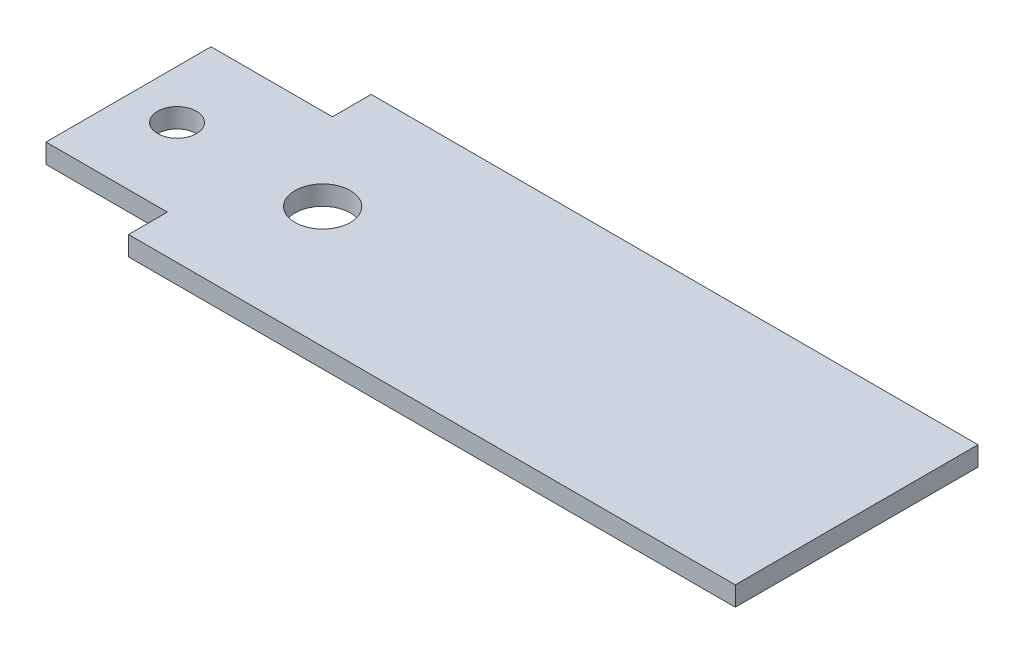
ISO-10303-21;
HEADER;
FILE_DESCRIPTION(('STEP AP214'),'2;1');
FILE_NAME('part.step','',(''),(''),'','','');
FILE_SCHEMA(('AUTOMOTIVE_DESIGN { 1 0 10303 214 1 1 1 1 }'));
ENDSEC;
DATA;
#1=APPLICATION_CONTEXT('core data for automotive mechanical design processes');
#2=APPLICATION_PROTOCOL_DEFINITION('international standard','automotive_design',2000,#1);
#3=PRODUCT_CONTEXT('',#1,'mechanical');
#4=PRODUCT('Part','Part','',(#3));
#5=PRODUCT_RELATED_PRODUCT_CATEGORY('part','',(#4));
#6=PRODUCT_DEFINITION_FORMATION('','',#4);
#7=PRODUCT_DEFINITION_CONTEXT('part definition',#1,'design');
#8=PRODUCT_DEFINITION('design','',#6,#7);
#9=PRODUCT_DEFINITION_SHAPE('','',#8);
#10=(LENGTH_UNIT() NAMED_UNIT(*) SI_UNIT(.MILLI.,.METRE.));
#11=(NAMED_UNIT(*) PLANE_ANGLE_UNIT() SI_UNIT($,.RADIAN.));
#12=(NAMED_UNIT(*) SI_UNIT($,.STERADIAN.) SOLID_ANGLE_UNIT());
#13=UNCERTAINTY_MEASURE_WITH_UNIT(LENGTH_MEASURE(1.E-05),#10,'distance_accuracy_value','');
#14=(GEOMETRIC_REPRESENTATION_CONTEXT(3) GLOBAL_UNCERTAINTY_ASSIGNED_CONTEXT((#13)) GLOBAL_UNIT_ASSIGNED_CONTEXT((#10,
#11,#12)) REPRESENTATION_CONTEXT('',''));
#15=CARTESIAN_POINT('',(0.,0.,0.));
#16=DIRECTION('',(0.,0.,1.));
#17=DIRECTION('',(1.,0.,0.));
#18=AXIS2_PLACEMENT_3D('',#15,#16,#17);
#19=CARTESIAN_POINT('',(75.,4.,-25.));
#20=DIRECTION('',(-1.,0.,0.));
#21=DIRECTION('',(0.,0.,1.));
#22=AXIS2_PLACEMENT_3D('',#19,#20,#21);
#23=PLANE('',#22);
#24=DIRECTION('',(0.,0.,-1.));
#25=VECTOR('',#24,1.);
#26=CARTESIAN_POINT('',(75.,0.,-25.));
#27=LINE('',#26,#25);
#28=CARTESIAN_POINT('',(75.,0.,25.));
#29=VERTEX_POINT('',#28);
#30=CARTESIAN_POINT('',(75.,0.,-25.));
#31=VERTEX_POINT('',#30);
#32=EDGE_CURVE('E124',#29,#31,#27,.T.);
#33=ORIENTED_EDGE('',*,*,#32,.T.);
#34=DIRECTION('',(0.,-1.,0.));
#35=VECTOR('',#34,1.);
#36=CARTESIAN_POINT('',(75.,4.,-25.));
#37=LINE('',#36,#35);
#38=CARTESIAN_POINT('',(75.,4.,-25.));
#39=VERTEX_POINT('',#38);
#40=EDGE_CURVE('E11',#39,#31,#37,.T.);
#41=ORIENTED_EDGE('',*,*,#40,.F.);
#42=DIRECTION('',(0.,0.,-1.));
#43=VECTOR('',#42,1.);
#44=CARTESIAN_POINT('',(75.,4.,-25.));
#45=LINE('',#44,#43);
#46=CARTESIAN_POINT('',(75.,4.,25.));
#47=VERTEX_POINT('',#46);
#48=EDGE_CURVE('E121',#47,#39,#45,.T.);
#49=ORIENTED_EDGE('',*,*,#48,.F.);
#50=DIRECTION('',(0.,-1.,0.));
#51=VECTOR('',#50,1.);
#52=CARTESIAN_POINT('',(75.,4.,25.));
#53=LINE('',#52,#51);
#54=EDGE_CURVE('E40',#47,#29,#53,.T.);
#55=ORIENTED_EDGE('',*,*,#54,.T.);
#56=EDGE_LOOP('',(#33,#41,#49,#55));
#57=FACE_BOUND('',#56,.T.);
#58=ADVANCED_FACE('F33',(#57),#23,.F.);
#59=CARTESIAN_POINT('',(-75.,4.,-25.));
#60=DIRECTION('',(0.,0.,1.));
#61=DIRECTION('',(1.,0.,0.));
#62=AXIS2_PLACEMENT_3D('',#59,#60,#61);
#63=PLANE('',#62);
#64=DIRECTION('',(-1.,0.,0.));
#65=VECTOR('',#64,1.);
#66=CARTESIAN_POINT('',(-75.,0.,-25.));
#67=LINE('',#66,#65);
#68=CARTESIAN_POINT('',(-50.,0.,-25.));
#69=VERTEX_POINT('',#68);
#70=EDGE_CURVE('E119',#31,#69,#67,.T.);
#71=ORIENTED_EDGE('',*,*,#70,.T.);
#72=DIRECTION('',(0.,1.,0.));
#73=VECTOR('',#72,1.);
#74=CARTESIAN_POINT('',(-50.,0.,-25.));
#75=LINE('',#74,#73);
#76=CARTESIAN_POINT('',(-50.,4.,-25.));
#77=VERTEX_POINT('',#76);
#78=EDGE_CURVE('E161',#69,#77,#75,.T.);
#79=ORIENTED_EDGE('',*,*,#78,.T.);
#80=DIRECTION('',(-1.,0.,0.));
#81=VECTOR('',#80,1.);
#82=CARTESIAN_POINT('',(-75.,4.,-25.));
#83=LINE('',#82,#81);
#84=EDGE_CURVE('E139',#39,#77,#83,.T.);
#85=ORIENTED_EDGE('',*,*,#84,.F.);
#86=ORIENTED_EDGE('',*,*,#40,.T.);
#87=EDGE_LOOP('',(#71,#79,#85,#86));
#88=FACE_BOUND('',#87,.T.);
#89=ADVANCED_FACE('F167',(#88),#63,.F.);
#90=CARTESIAN_POINT('',(-75.,4.,-25.));
#91=DIRECTION('',(1.,0.,0.));
#92=DIRECTION('',(0.,0.,-1.));
#93=AXIS2_PLACEMENT_3D('',#90,#91,#92);
#94=PLANE('',#93);
#95=DIRECTION('',(0.,0.,1.));
#96=VECTOR('',#95,1.);
#97=CARTESIAN_POINT('',(-75.,4.,-25.));
#98=LINE('',#97,#96);
#99=CARTESIAN_POINT('',(-75.,4.,-17.));
#100=VERTEX_POINT('',#99);
#101=CARTESIAN_POINT('',(-75.,4.,17.));
#102=VERTEX_POINT('',#101);
#103=EDGE_CURVE('E114',#100,#102,#98,.T.);
#104=ORIENTED_EDGE('',*,*,#103,.F.);
#105=DIRECTION('',(0.,1.,0.));
#106=VECTOR('',#105,1.);
#107=CARTESIAN_POINT('',(-75.,0.,-17.));
#108=LINE('',#107,#106);
#109=CARTESIAN_POINT('',(-75.,0.,-17.));
#110=VERTEX_POINT('',#109);
#111=EDGE_CURVE('E100',#110,#100,#108,.T.);
#112=ORIENTED_EDGE('',*,*,#111,.F.);
#113=DIRECTION('',(0.,0.,1.));
#114=VECTOR('',#113,1.);
#115=CARTESIAN_POINT('',(-75.,0.,-25.));
#116=LINE('',#115,#114);
#117=CARTESIAN_POINT('',(-75.,0.,17.));
#118=VERTEX_POINT('',#117);
#119=EDGE_CURVE('E112',#110,#118,#116,.T.);
#120=ORIENTED_EDGE('',*,*,#119,.T.);
#121=DIRECTION('',(0.,1.,0.));
#122=VECTOR('',#121,1.);
#123=CARTESIAN_POINT('',(-75.,0.,17.));
#124=LINE('',#123,#122);
#125=EDGE_CURVE('E181',#118,#102,#124,.T.);
#126=ORIENTED_EDGE('',*,*,#125,.T.);
#127=EDGE_LOOP('',(#104,#112,#120,#126));
#128=FACE_BOUND('',#127,.T.);
#129=ADVANCED_FACE('F110',(#128),#94,.F.);
#130=CARTESIAN_POINT('',(-75.,4.,25.));
#131=DIRECTION('',(0.,0.,-1.));
#132=DIRECTION('',(-1.,0.,0.));
#133=AXIS2_PLACEMENT_3D('',#130,#131,#132);
#134=PLANE('',#133);
#135=DIRECTION('',(1.,0.,0.));
#136=VECTOR('',#135,1.);
#137=CARTESIAN_POINT('',(-75.,4.,25.));
#138=LINE('',#137,#136);
#139=CARTESIAN_POINT('',(-50.,4.,25.));
#140=VERTEX_POINT('',#139);
#141=EDGE_CURVE('E128',#140,#47,#138,.T.);
#142=ORIENTED_EDGE('',*,*,#141,.F.);
#143=DIRECTION('',(0.,1.,0.));
#144=VECTOR('',#143,1.);
#145=CARTESIAN_POINT('',(-50.,0.,25.));
#146=LINE('',#145,#144);
#147=CARTESIAN_POINT('',(-50.,0.,25.));
#148=VERTEX_POINT('',#147);
#149=EDGE_CURVE('E153',#148,#140,#146,.T.);
#150=ORIENTED_EDGE('',*,*,#149,.F.);
#151=DIRECTION('',(1.,0.,0.));
#152=VECTOR('',#151,1.);
#153=CARTESIAN_POINT('',(-75.,0.,25.));
#154=LINE('',#153,#152);
#155=EDGE_CURVE('E118',#148,#29,#154,.T.);
#156=ORIENTED_EDGE('',*,*,#155,.T.);
#157=ORIENTED_EDGE('',*,*,#54,.F.);
#158=EDGE_LOOP('',(#142,#150,#156,#157));
#159=FACE_BOUND('',#158,.T.);
#160=ADVANCED_FACE('F190',(#159),#134,.F.);
#161=CARTESIAN_POINT('',(0.,4.,0.));
#162=DIRECTION('',(0.,1.,0.));
#163=DIRECTION('',(0.,0.,1.));
#164=AXIS2_PLACEMENT_3D('',#161,#162,#163);
#165=PLANE('',#164);
#166=DIRECTION('',(0.,0.,-1.));
#167=VECTOR('',#166,1.);
#168=CARTESIAN_POINT('',(-50.,4.,-25.));
#169=LINE('',#168,#167);
#170=CARTESIAN_POINT('',(-50.,4.,-17.));
#171=VERTEX_POINT('',#170);
#172=EDGE_CURVE('E105',#171,#77,#169,.T.);
#173=ORIENTED_EDGE('',*,*,#172,.F.);
#174=DIRECTION('',(1.,0.,0.));
#175=VECTOR('',#174,1.);
#176=CARTESIAN_POINT('',(-75.,4.,-17.));
#177=LINE('',#176,#175);
#178=EDGE_CURVE('E182',#100,#171,#177,.T.);
#179=ORIENTED_EDGE('',*,*,#178,.F.);
#180=ORIENTED_EDGE('',*,*,#103,.T.);
#181=DIRECTION('',(-1.,0.,0.));
#182=VECTOR('',#181,1.);
#183=CARTESIAN_POINT('',(-75.,4.,17.));
#184=LINE('',#183,#182);
#185=CARTESIAN_POINT('',(-50.,4.,17.));
#186=VERTEX_POINT('',#185);
#187=EDGE_CURVE('E175',#186,#102,#184,.T.);
#188=ORIENTED_EDGE('',*,*,#187,.F.);
#189=DIRECTION('',(0.,0.,-1.));
#190=VECTOR('',#189,1.);
#191=CARTESIAN_POINT('',(-50.,4.,25.));
#192=LINE('',#191,#190);
#193=EDGE_CURVE('E177',#140,#186,#192,.T.);
#194=ORIENTED_EDGE('',*,*,#193,.F.);
#195=ORIENTED_EDGE('',*,*,#141,.T.);
#196=ORIENTED_EDGE('',*,*,#48,.T.);
#197=ORIENTED_EDGE('',*,*,#84,.T.);
#198=EDGE_LOOP('',(#173,#179,#180,#188,#194,#195,#196,#197));
#199=FACE_BOUND('',#198,.T.);
#200=CARTESIAN_POINT('',(-65.,4.,0.));
#201=DIRECTION('',(0.,-1.,0.));
#202=DIRECTION('',(0.,0.,-1.));
#203=AXIS2_PLACEMENT_3D('',#200,#201,#202);
#204=CIRCLE('',#203,4.00000000000001);
#205=CARTESIAN_POINT('',(-65.,4.,-4.00000000000001));
#206=VERTEX_POINT('',#205);
#207=EDGE_CURVE('E142',#206,#206,#204,.T.);
#208=ORIENTED_EDGE('',*,*,#207,.T.);
#209=EDGE_LOOP('',(#208));
#210=FACE_BOUND('',#209,.T.);
#211=CARTESIAN_POINT('',(-35.,4.,0.));
#212=DIRECTION('',(0.,-1.,0.));
#213=DIRECTION('',(0.,0.,-1.));
#214=AXIS2_PLACEMENT_3D('',#211,#212,#213);
#215=CIRCLE('',#214,5.7);
#216=CARTESIAN_POINT('',(-35.,4.,-5.7));
#217=VERTEX_POINT('',#216);
#218=EDGE_CURVE('E150',#217,#217,#215,.T.);
#219=ORIENTED_EDGE('',*,*,#218,.T.);
#220=EDGE_LOOP('',(#219));
#221=FACE_BOUND('',#220,.T.);
#222=ADVANCED_FACE('F164',(#199,#210,#221),#165,.T.);
#223=CARTESIAN_POINT('',(0.,0.,0.));
#224=DIRECTION('',(0.,1.,0.));
#225=DIRECTION('',(0.,0.,1.));
#226=AXIS2_PLACEMENT_3D('',#223,#224,#225);
#227=PLANE('',#226);
#228=CARTESIAN_POINT('',(-65.,0.,0.));
#229=DIRECTION('',(0.,-1.,0.));
#230=DIRECTION('',(0.,0.,-1.));
#231=AXIS2_PLACEMENT_3D('',#228,#229,#230);
#232=CIRCLE('',#231,4.00000000000001);
#233=CARTESIAN_POINT('',(-65.,0.,-4.00000000000001));
#234=VERTEX_POINT('',#233);
#235=EDGE_CURVE('E145',#234,#234,#232,.T.);
#236=ORIENTED_EDGE('',*,*,#235,.F.);
#237=EDGE_LOOP('',(#236));
#238=FACE_BOUND('',#237,.T.);
#239=CARTESIAN_POINT('',(-35.,0.,0.));
#240=DIRECTION('',(0.,-1.,0.));
#241=DIRECTION('',(0.,0.,-1.));
#242=AXIS2_PLACEMENT_3D('',#239,#240,#241);
#243=CIRCLE('',#242,5.7);
#244=CARTESIAN_POINT('',(-35.,0.,-5.7));
#245=VERTEX_POINT('',#244);
#246=EDGE_CURVE('E158',#245,#245,#243,.T.);
#247=ORIENTED_EDGE('',*,*,#246,.F.);
#248=EDGE_LOOP('',(#247));
#249=FACE_BOUND('',#248,.T.);
#250=DIRECTION('',(1.,0.,0.));
#251=VECTOR('',#250,1.);
#252=CARTESIAN_POINT('',(-75.,0.,-17.));
#253=LINE('',#252,#251);
#254=CARTESIAN_POINT('',(-50.,0.,-17.));
#255=VERTEX_POINT('',#254);
#256=EDGE_CURVE('E96',#110,#255,#253,.T.);
#257=ORIENTED_EDGE('',*,*,#256,.T.);
#258=DIRECTION('',(0.,0.,-1.));
#259=VECTOR('',#258,1.);
#260=CARTESIAN_POINT('',(-50.,0.,-25.));
#261=LINE('',#260,#259);
#262=EDGE_CURVE('E47',#255,#69,#261,.T.);
#263=ORIENTED_EDGE('',*,*,#262,.T.);
#264=ORIENTED_EDGE('',*,*,#70,.F.);
#265=ORIENTED_EDGE('',*,*,#32,.F.);
#266=ORIENTED_EDGE('',*,*,#155,.F.);
#267=DIRECTION('',(0.,0.,-1.));
#268=VECTOR('',#267,1.);
#269=CARTESIAN_POINT('',(-50.,0.,25.));
#270=LINE('',#269,#268);
#271=CARTESIAN_POINT('',(-50.,0.,17.));
#272=VERTEX_POINT('',#271);
#273=EDGE_CURVE('E173',#148,#272,#270,.T.);
#274=ORIENTED_EDGE('',*,*,#273,.T.);
#275=DIRECTION('',(-1.,0.,0.));
#276=VECTOR('',#275,1.);
#277=CARTESIAN_POINT('',(-75.,0.,17.));
#278=LINE('',#277,#276);
#279=EDGE_CURVE('E55',#272,#118,#278,.T.);
#280=ORIENTED_EDGE('',*,*,#279,.T.);
#281=ORIENTED_EDGE('',*,*,#119,.F.);
#282=EDGE_LOOP('',(#257,#263,#264,#265,#266,#274,#280,#281));
#283=FACE_BOUND('',#282,.T.);
#284=ADVANCED_FACE('F116',(#238,#249,#283),#227,.F.);
#285=CARTESIAN_POINT('',(-35.,4.,0.));
#286=DIRECTION('',(0.,-1.,0.));
#287=DIRECTION('',(0.,0.,-1.));
#288=AXIS2_PLACEMENT_3D('',#285,#286,#287);
#289=CYLINDRICAL_SURFACE('',#288,5.7);
#290=ORIENTED_EDGE('',*,*,#218,.F.);
#291=EDGE_LOOP('',(#290));
#292=FACE_BOUND('',#291,.T.);
#293=ORIENTED_EDGE('',*,*,#246,.T.);
#294=EDGE_LOOP('',(#293));
#295=FACE_BOUND('',#294,.T.);
#296=ADVANCED_FACE('F204',(#292,#295),#289,.F.);
#297=CARTESIAN_POINT('',(-65.,4.,0.));
#298=DIRECTION('',(0.,-1.,0.));
#299=DIRECTION('',(0.,0.,-1.));
#300=AXIS2_PLACEMENT_3D('',#297,#298,#299);
#301=CYLINDRICAL_SURFACE('',#300,4.00000000000001);
#302=ORIENTED_EDGE('',*,*,#207,.F.);
#303=EDGE_LOOP('',(#302));
#304=FACE_BOUND('',#303,.T.);
#305=ORIENTED_EDGE('',*,*,#235,.T.);
#306=EDGE_LOOP('',(#305));
#307=FACE_BOUND('',#306,.T.);
#308=ADVANCED_FACE('F210',(#304,#307),#301,.F.);
#309=CARTESIAN_POINT('',(-75.,0.,17.));
#310=DIRECTION('',(0.,0.,-1.));
#311=DIRECTION('',(-1.,0.,0.));
#312=AXIS2_PLACEMENT_3D('',#309,#310,#311);
#313=PLANE('',#312);
#314=ORIENTED_EDGE('',*,*,#187,.T.);
#315=ORIENTED_EDGE('',*,*,#125,.F.);
#316=ORIENTED_EDGE('',*,*,#279,.F.);
#317=DIRECTION('',(0.,1.,0.));
#318=VECTOR('',#317,1.);
#319=CARTESIAN_POINT('',(-50.,0.,17.));
#320=LINE('',#319,#318);
#321=EDGE_CURVE('E183',#272,#186,#320,.T.);
#322=ORIENTED_EDGE('',*,*,#321,.T.);
#323=EDGE_LOOP('',(#314,#315,#316,#322));
#324=FACE_BOUND('',#323,.T.);
#325=ADVANCED_FACE('F214',(#324),#313,.F.);
#326=CARTESIAN_POINT('',(-50.,0.,25.));
#327=DIRECTION('',(1.,0.,0.));
#328=DIRECTION('',(0.,0.,-1.));
#329=AXIS2_PLACEMENT_3D('',#326,#327,#328);
#330=PLANE('',#329);
#331=ORIENTED_EDGE('',*,*,#193,.T.);
#332=ORIENTED_EDGE('',*,*,#321,.F.);
#333=ORIENTED_EDGE('',*,*,#273,.F.);
#334=ORIENTED_EDGE('',*,*,#149,.T.);
#335=EDGE_LOOP('',(#331,#332,#333,#334));
#336=FACE_BOUND('',#335,.T.);
#337=ADVANCED_FACE('F186',(#336),#330,.F.);
#338=CARTESIAN_POINT('',(-50.,0.,-25.));
#339=DIRECTION('',(1.,0.,0.));
#340=DIRECTION('',(0.,0.,-1.));
#341=AXIS2_PLACEMENT_3D('',#338,#339,#340);
#342=PLANE('',#341);
#343=ORIENTED_EDGE('',*,*,#172,.T.);
#344=ORIENTED_EDGE('',*,*,#78,.F.);
#345=ORIENTED_EDGE('',*,*,#262,.F.);
#346=DIRECTION('',(0.,1.,0.));
#347=VECTOR('',#346,1.);
#348=CARTESIAN_POINT('',(-50.,0.,-17.));
#349=LINE('',#348,#347);
#350=EDGE_CURVE('E102',#255,#171,#349,.T.);
#351=ORIENTED_EDGE('',*,*,#350,.T.);
#352=EDGE_LOOP('',(#343,#344,#345,#351));
#353=FACE_BOUND('',#352,.T.);
#354=ADVANCED_FACE('F218',(#353),#342,.F.);
#355=CARTESIAN_POINT('',(-75.,0.,-17.));
#356=DIRECTION('',(0.,0.,1.));
#357=DIRECTION('',(1.,0.,0.));
#358=AXIS2_PLACEMENT_3D('',#355,#356,#357);
#359=PLANE('',#358);
#360=ORIENTED_EDGE('',*,*,#178,.T.);
#361=ORIENTED_EDGE('',*,*,#350,.F.);
#362=ORIENTED_EDGE('',*,*,#256,.F.);
#363=ORIENTED_EDGE('',*,*,#111,.T.);
#364=EDGE_LOOP('',(#360,#361,#362,#363));
#365=FACE_BOUND('',#364,.T.);
#366=ADVANCED_FACE('F99',(#365),#359,.F.);
#367=CLOSED_SHELL('',(#58,#89,#129,#160,#222,#284,#296,#308,#325,#337,#354,#366));
#368=MANIFOLD_SOLID_BREP('B2',#367);
#369=ADVANCED_BREP_SHAPE_REPRESENTATION('',(#18,#368),#14);
#370=SHAPE_DEFINITION_REPRESENTATION(#9,#369);
ENDSEC;
END-ISO-10303-21;
